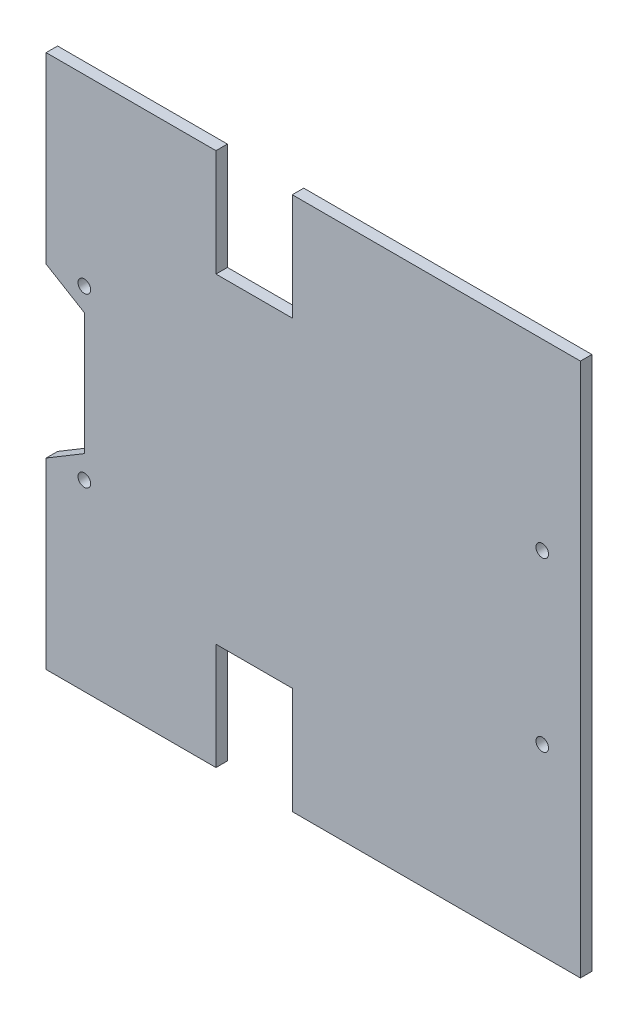
ISO-10303-21;
HEADER;
FILE_DESCRIPTION(('STEP AP214'),'2;1');
FILE_NAME('part.step','',(''),(''),'','','');
FILE_SCHEMA(('AUTOMOTIVE_DESIGN { 1 0 10303 214 1 1 1 1 }'));
ENDSEC;
DATA;
#1=APPLICATION_CONTEXT('core data for automotive mechanical design processes');
#2=APPLICATION_PROTOCOL_DEFINITION('international standard','automotive_design',2000,#1);
#3=PRODUCT_CONTEXT('',#1,'mechanical');
#4=PRODUCT('Part','Part','',(#3));
#5=PRODUCT_RELATED_PRODUCT_CATEGORY('part','',(#4));
#6=PRODUCT_DEFINITION_FORMATION('','',#4);
#7=PRODUCT_DEFINITION_CONTEXT('part definition',#1,'design');
#8=PRODUCT_DEFINITION('design','',#6,#7);
#9=PRODUCT_DEFINITION_SHAPE('','',#8);
#10=(LENGTH_UNIT() NAMED_UNIT(*) SI_UNIT(.MILLI.,.METRE.));
#11=(NAMED_UNIT(*) PLANE_ANGLE_UNIT() SI_UNIT($,.RADIAN.));
#12=(NAMED_UNIT(*) SI_UNIT($,.STERADIAN.) SOLID_ANGLE_UNIT());
#13=UNCERTAINTY_MEASURE_WITH_UNIT(LENGTH_MEASURE(1.E-05),#10,'distance_accuracy_value','');
#14=(GEOMETRIC_REPRESENTATION_CONTEXT(3) GLOBAL_UNCERTAINTY_ASSIGNED_CONTEXT((#13)) GLOBAL_UNIT_ASSIGNED_CONTEXT((#10,
#11,#12)) REPRESENTATION_CONTEXT('',''));
#15=CARTESIAN_POINT('',(0.,0.,0.));
#16=DIRECTION('',(0.,0.,1.));
#17=DIRECTION('',(1.,0.,0.));
#18=AXIS2_PLACEMENT_3D('',#15,#16,#17);
#19=CARTESIAN_POINT('',(0.,-26.,3.));
#20=DIRECTION('',(0.,0.,1.));
#21=DIRECTION('',(1.,0.,0.));
#22=AXIS2_PLACEMENT_3D('',#19,#20,#21);
#23=PLANE('',#22);
#24=CARTESIAN_POINT('',(10.,22.,3.));
#25=DIRECTION('',(0.,0.,1.));
#26=DIRECTION('',(1.,0.,0.));
#27=AXIS2_PLACEMENT_3D('',#24,#25,#26);
#28=CIRCLE('',#27,1.65);
#29=CARTESIAN_POINT('',(11.65,22.,3.));
#30=VERTEX_POINT('',#29);
#31=EDGE_CURVE('E346',#30,#30,#28,.T.);
#32=ORIENTED_EDGE('',*,*,#31,.F.);
#33=EDGE_LOOP('',(#32));
#34=FACE_BOUND('',#33,.T.);
#35=CARTESIAN_POINT('',(130.,66.,3.));
#36=DIRECTION('',(0.,0.,1.));
#37=DIRECTION('',(-1.,0.,0.));
#38=AXIS2_PLACEMENT_3D('',#35,#36,#37);
#39=CIRCLE('',#38,1.65000000000002);
#40=CARTESIAN_POINT('',(128.35,66.,3.));
#41=VERTEX_POINT('',#40);
#42=EDGE_CURVE('E183',#41,#41,#39,.T.);
#43=ORIENTED_EDGE('',*,*,#42,.F.);
#44=EDGE_LOOP('',(#43));
#45=FACE_BOUND('',#44,.T.);
#46=DIRECTION('',(0.,-1.,0.));
#47=VECTOR('',#46,1.);
#48=CARTESIAN_POINT('',(0.,21.9999999999925,3.));
#49=LINE('',#48,#47);
#50=CARTESIAN_POINT('',(0.,21.9999999999925,3.));
#51=VERTEX_POINT('',#50);
#52=CARTESIAN_POINT('',(0.,-26.,3.));
#53=VERTEX_POINT('',#52);
#54=EDGE_CURVE('E211',#51,#53,#49,.T.);
#55=ORIENTED_EDGE('',*,*,#54,.T.);
#56=DIRECTION('',(1.,0.,0.));
#57=VECTOR('',#56,1.);
#58=CARTESIAN_POINT('',(0.,-26.,3.));
#59=LINE('',#58,#57);
#60=CARTESIAN_POINT('',(44.5,-26.,3.));
#61=VERTEX_POINT('',#60);
#62=EDGE_CURVE('E118',#53,#61,#59,.T.);
#63=ORIENTED_EDGE('',*,*,#62,.T.);
#64=DIRECTION('',(0.,1.,0.));
#65=VECTOR('',#64,1.);
#66=CARTESIAN_POINT('',(44.5,-26.,3.));
#67=LINE('',#66,#65);
#68=CARTESIAN_POINT('',(44.5,1.99999999999998,3.));
#69=VERTEX_POINT('',#68);
#70=EDGE_CURVE('E250',#61,#69,#67,.T.);
#71=ORIENTED_EDGE('',*,*,#70,.T.);
#72=DIRECTION('',(1.,0.,0.));
#73=VECTOR('',#72,1.);
#74=CARTESIAN_POINT('',(44.5,1.99999999999998,3.));
#75=LINE('',#74,#73);
#76=CARTESIAN_POINT('',(64.5,1.99999999999999,3.));
#77=VERTEX_POINT('',#76);
#78=EDGE_CURVE('E269',#69,#77,#75,.T.);
#79=ORIENTED_EDGE('',*,*,#78,.T.);
#80=DIRECTION('',(0.,-1.,0.));
#81=VECTOR('',#80,1.);
#82=CARTESIAN_POINT('',(64.5,-26.,3.));
#83=LINE('',#82,#81);
#84=CARTESIAN_POINT('',(64.5,-26.,3.));
#85=VERTEX_POINT('',#84);
#86=EDGE_CURVE('E266',#77,#85,#83,.T.);
#87=ORIENTED_EDGE('',*,*,#86,.T.);
#88=DIRECTION('',(1.,0.,0.));
#89=VECTOR('',#88,1.);
#90=CARTESIAN_POINT('',(64.5,-26.,3.));
#91=LINE('',#90,#89);
#92=CARTESIAN_POINT('',(140.,-26.,3.));
#93=VERTEX_POINT('',#92);
#94=EDGE_CURVE('E268',#85,#93,#91,.T.);
#95=ORIENTED_EDGE('',*,*,#94,.T.);
#96=DIRECTION('',(0.,1.,0.));
#97=VECTOR('',#96,1.);
#98=CARTESIAN_POINT('',(140.,-26.,3.));
#99=LINE('',#98,#97);
#100=CARTESIAN_POINT('',(140.,114.,3.));
#101=VERTEX_POINT('',#100);
#102=EDGE_CURVE('E271',#93,#101,#99,.T.);
#103=ORIENTED_EDGE('',*,*,#102,.T.);
#104=DIRECTION('',(-1.,0.,0.));
#105=VECTOR('',#104,1.);
#106=CARTESIAN_POINT('',(64.5,114.,3.));
#107=LINE('',#106,#105);
#108=CARTESIAN_POINT('',(64.5,114.,3.));
#109=VERTEX_POINT('',#108);
#110=EDGE_CURVE('E277',#101,#109,#107,.T.);
#111=ORIENTED_EDGE('',*,*,#110,.T.);
#112=DIRECTION('',(0.,-1.,0.));
#113=VECTOR('',#112,1.);
#114=CARTESIAN_POINT('',(64.5,86.,3.));
#115=LINE('',#114,#113);
#116=CARTESIAN_POINT('',(64.5,86.,3.));
#117=VERTEX_POINT('',#116);
#118=EDGE_CURVE('E279',#109,#117,#115,.T.);
#119=ORIENTED_EDGE('',*,*,#118,.T.);
#120=DIRECTION('',(-1.,0.,0.));
#121=VECTOR('',#120,1.);
#122=CARTESIAN_POINT('',(64.5,86.,3.));
#123=LINE('',#122,#121);
#124=CARTESIAN_POINT('',(44.5,86.,3.));
#125=VERTEX_POINT('',#124);
#126=EDGE_CURVE('E281',#117,#125,#123,.T.);
#127=ORIENTED_EDGE('',*,*,#126,.T.);
#128=DIRECTION('',(0.,1.,0.));
#129=VECTOR('',#128,1.);
#130=CARTESIAN_POINT('',(44.5,86.,3.));
#131=LINE('',#130,#129);
#132=CARTESIAN_POINT('',(44.5,114.,3.));
#133=VERTEX_POINT('',#132);
#134=EDGE_CURVE('E283',#125,#133,#131,.T.);
#135=ORIENTED_EDGE('',*,*,#134,.T.);
#136=DIRECTION('',(-1.,0.,0.));
#137=VECTOR('',#136,1.);
#138=CARTESIAN_POINT('',(0.,114.,3.));
#139=LINE('',#138,#137);
#140=CARTESIAN_POINT('',(0.,114.,3.));
#141=VERTEX_POINT('',#140);
#142=EDGE_CURVE('E285',#133,#141,#139,.T.);
#143=ORIENTED_EDGE('',*,*,#142,.T.);
#144=DIRECTION('',(0.,-1.,0.));
#145=VECTOR('',#144,1.);
#146=CARTESIAN_POINT('',(0.,114.,3.));
#147=LINE('',#146,#145);
#148=CARTESIAN_POINT('',(0.,66.0000000000075,3.));
#149=VERTEX_POINT('',#148);
#150=EDGE_CURVE('E161',#141,#149,#147,.T.);
#151=ORIENTED_EDGE('',*,*,#150,.T.);
#152=DIRECTION('',(0.857492925712262,-0.514495755427997,0.));
#153=VECTOR('',#152,1.);
#154=CARTESIAN_POINT('',(9.99999999999995,60.,3.));
#155=LINE('',#154,#153);
#156=CARTESIAN_POINT('',(9.99999999999995,60.,3.));
#157=VERTEX_POINT('',#156);
#158=EDGE_CURVE('E155',#149,#157,#155,.T.);
#159=ORIENTED_EDGE('',*,*,#158,.T.);
#160=DIRECTION('',(0.,-1.,0.));
#161=VECTOR('',#160,1.);
#162=CARTESIAN_POINT('',(9.99999999999995,60.,3.));
#163=LINE('',#162,#161);
#164=CARTESIAN_POINT('',(9.99999999999995,28.,3.));
#165=VERTEX_POINT('',#164);
#166=EDGE_CURVE('E159',#157,#165,#163,.T.);
#167=ORIENTED_EDGE('',*,*,#166,.T.);
#168=DIRECTION('',(-0.857492925712261,-0.514495755427998,0.));
#169=VECTOR('',#168,1.);
#170=CARTESIAN_POINT('',(9.99999999999995,28.,3.));
#171=LINE('',#170,#169);
#172=EDGE_CURVE('E51',#165,#51,#171,.T.);
#173=ORIENTED_EDGE('',*,*,#172,.T.);
#174=EDGE_LOOP('',(#55,#63,#71,#79,#87,#95,#103,#111,#119,#127,#135,#143,#151,#159,#167,#173));
#175=FACE_BOUND('',#174,.T.);
#176=CARTESIAN_POINT('',(10.,66.,3.));
#177=DIRECTION('',(0.,0.,1.));
#178=DIRECTION('',(-1.,0.,0.));
#179=AXIS2_PLACEMENT_3D('',#176,#177,#178);
#180=CIRCLE('',#179,1.65);
#181=CARTESIAN_POINT('',(8.35000000000001,66.,3.));
#182=VERTEX_POINT('',#181);
#183=EDGE_CURVE('E352',#182,#182,#180,.T.);
#184=ORIENTED_EDGE('',*,*,#183,.F.);
#185=EDGE_LOOP('',(#184));
#186=FACE_BOUND('',#185,.T.);
#187=CARTESIAN_POINT('',(130.,22.,3.));
#188=DIRECTION('',(0.,0.,1.));
#189=DIRECTION('',(1.,0.,0.));
#190=AXIS2_PLACEMENT_3D('',#187,#188,#189);
#191=CIRCLE('',#190,1.65000000000002);
#192=CARTESIAN_POINT('',(131.65,22.,3.));
#193=VERTEX_POINT('',#192);
#194=EDGE_CURVE('E337',#193,#193,#191,.T.);
#195=ORIENTED_EDGE('',*,*,#194,.F.);
#196=EDGE_LOOP('',(#195));
#197=FACE_BOUND('',#196,.T.);
#198=ADVANCED_FACE('F34',(#34,#45,#175,#186,#197),#23,.T.);
#199=CARTESIAN_POINT('',(0.,-26.,0.));
#200=DIRECTION('',(0.,0.,1.));
#201=DIRECTION('',(1.,0.,0.));
#202=AXIS2_PLACEMENT_3D('',#199,#200,#201);
#203=PLANE('',#202);
#204=CARTESIAN_POINT('',(10.,22.,0.));
#205=DIRECTION('',(0.,0.,1.));
#206=DIRECTION('',(1.,0.,0.));
#207=AXIS2_PLACEMENT_3D('',#204,#205,#206);
#208=CIRCLE('',#207,1.65);
#209=CARTESIAN_POINT('',(11.65,22.,0.));
#210=VERTEX_POINT('',#209);
#211=EDGE_CURVE('E343',#210,#210,#208,.T.);
#212=ORIENTED_EDGE('',*,*,#211,.T.);
#213=EDGE_LOOP('',(#212));
#214=FACE_BOUND('',#213,.T.);
#215=CARTESIAN_POINT('',(130.,66.,0.));
#216=DIRECTION('',(0.,0.,1.));
#217=DIRECTION('',(-1.,0.,0.));
#218=AXIS2_PLACEMENT_3D('',#215,#216,#217);
#219=CIRCLE('',#218,1.65000000000002);
#220=CARTESIAN_POINT('',(128.35,66.,0.));
#221=VERTEX_POINT('',#220);
#222=EDGE_CURVE('E355',#221,#221,#219,.T.);
#223=ORIENTED_EDGE('',*,*,#222,.T.);
#224=EDGE_LOOP('',(#223));
#225=FACE_BOUND('',#224,.T.);
#226=DIRECTION('',(0.,-1.,0.));
#227=VECTOR('',#226,1.);
#228=CARTESIAN_POINT('',(0.,21.9999999999925,0.));
#229=LINE('',#228,#227);
#230=CARTESIAN_POINT('',(0.,21.9999999999925,0.));
#231=VERTEX_POINT('',#230);
#232=CARTESIAN_POINT('',(0.,-26.,0.));
#233=VERTEX_POINT('',#232);
#234=EDGE_CURVE('E179',#231,#233,#229,.T.);
#235=ORIENTED_EDGE('',*,*,#234,.F.);
#236=DIRECTION('',(-0.857492925712261,-0.514495755427998,0.));
#237=VECTOR('',#236,1.);
#238=CARTESIAN_POINT('',(9.99999999999995,28.,0.));
#239=LINE('',#238,#237);
#240=CARTESIAN_POINT('',(9.99999999999995,28.,0.));
#241=VERTEX_POINT('',#240);
#242=EDGE_CURVE('E110',#241,#231,#239,.T.);
#243=ORIENTED_EDGE('',*,*,#242,.F.);
#244=DIRECTION('',(0.,-1.,0.));
#245=VECTOR('',#244,1.);
#246=CARTESIAN_POINT('',(9.99999999999995,60.,0.));
#247=LINE('',#246,#245);
#248=CARTESIAN_POINT('',(9.99999999999995,60.,0.));
#249=VERTEX_POINT('',#248);
#250=EDGE_CURVE('E104',#249,#241,#247,.T.);
#251=ORIENTED_EDGE('',*,*,#250,.F.);
#252=DIRECTION('',(0.857492925712262,-0.514495755427997,0.));
#253=VECTOR('',#252,1.);
#254=CARTESIAN_POINT('',(9.99999999999995,60.,0.));
#255=LINE('',#254,#253);
#256=CARTESIAN_POINT('',(0.,66.0000000000075,0.));
#257=VERTEX_POINT('',#256);
#258=EDGE_CURVE('E169',#257,#249,#255,.T.);
#259=ORIENTED_EDGE('',*,*,#258,.F.);
#260=DIRECTION('',(0.,-1.,0.));
#261=VECTOR('',#260,1.);
#262=CARTESIAN_POINT('',(0.,114.,0.));
#263=LINE('',#262,#261);
#264=CARTESIAN_POINT('',(0.,114.,0.));
#265=VERTEX_POINT('',#264);
#266=EDGE_CURVE('E206',#265,#257,#263,.T.);
#267=ORIENTED_EDGE('',*,*,#266,.F.);
#268=DIRECTION('',(-1.,0.,0.));
#269=VECTOR('',#268,1.);
#270=CARTESIAN_POINT('',(0.,114.,0.));
#271=LINE('',#270,#269);
#272=CARTESIAN_POINT('',(44.5,114.,0.));
#273=VERTEX_POINT('',#272);
#274=EDGE_CURVE('E204',#273,#265,#271,.T.);
#275=ORIENTED_EDGE('',*,*,#274,.F.);
#276=DIRECTION('',(0.,1.,0.));
#277=VECTOR('',#276,1.);
#278=CARTESIAN_POINT('',(44.5,86.,0.));
#279=LINE('',#278,#277);
#280=CARTESIAN_POINT('',(44.5,86.,0.));
#281=VERTEX_POINT('',#280);
#282=EDGE_CURVE('E202',#281,#273,#279,.T.);
#283=ORIENTED_EDGE('',*,*,#282,.F.);
#284=DIRECTION('',(-1.,0.,0.));
#285=VECTOR('',#284,1.);
#286=CARTESIAN_POINT('',(64.5,86.,0.));
#287=LINE('',#286,#285);
#288=CARTESIAN_POINT('',(64.5,86.,0.));
#289=VERTEX_POINT('',#288);
#290=EDGE_CURVE('E200',#289,#281,#287,.T.);
#291=ORIENTED_EDGE('',*,*,#290,.F.);
#292=DIRECTION('',(0.,-1.,0.));
#293=VECTOR('',#292,1.);
#294=CARTESIAN_POINT('',(64.5,86.,0.));
#295=LINE('',#294,#293);
#296=CARTESIAN_POINT('',(64.5,114.,0.));
#297=VERTEX_POINT('',#296);
#298=EDGE_CURVE('E198',#297,#289,#295,.T.);
#299=ORIENTED_EDGE('',*,*,#298,.F.);
#300=DIRECTION('',(-1.,0.,0.));
#301=VECTOR('',#300,1.);
#302=CARTESIAN_POINT('',(64.5,114.,0.));
#303=LINE('',#302,#301);
#304=CARTESIAN_POINT('',(140.,114.,0.));
#305=VERTEX_POINT('',#304);
#306=EDGE_CURVE('E196',#305,#297,#303,.T.);
#307=ORIENTED_EDGE('',*,*,#306,.F.);
#308=DIRECTION('',(0.,1.,0.));
#309=VECTOR('',#308,1.);
#310=CARTESIAN_POINT('',(140.,114.,0.));
#311=LINE('',#310,#309);
#312=CARTESIAN_POINT('',(140.,-26.,0.));
#313=VERTEX_POINT('',#312);
#314=EDGE_CURVE('E194',#313,#305,#311,.T.);
#315=ORIENTED_EDGE('',*,*,#314,.F.);
#316=DIRECTION('',(1.,0.,0.));
#317=VECTOR('',#316,1.);
#318=CARTESIAN_POINT('',(64.5,-26.,0.));
#319=LINE('',#318,#317);
#320=CARTESIAN_POINT('',(64.5,-26.,0.));
#321=VERTEX_POINT('',#320);
#322=EDGE_CURVE('E191',#321,#313,#319,.T.);
#323=ORIENTED_EDGE('',*,*,#322,.F.);
#324=DIRECTION('',(0.,-1.,0.));
#325=VECTOR('',#324,1.);
#326=CARTESIAN_POINT('',(64.5,-26.,0.));
#327=LINE('',#326,#325);
#328=CARTESIAN_POINT('',(64.5,1.99999999999999,0.));
#329=VERTEX_POINT('',#328);
#330=EDGE_CURVE('E189',#329,#321,#327,.T.);
#331=ORIENTED_EDGE('',*,*,#330,.F.);
#332=DIRECTION('',(1.,0.,0.));
#333=VECTOR('',#332,1.);
#334=CARTESIAN_POINT('',(44.5,1.99999999999998,0.));
#335=LINE('',#334,#333);
#336=CARTESIAN_POINT('',(44.5,1.99999999999998,0.));
#337=VERTEX_POINT('',#336);
#338=EDGE_CURVE('E187',#337,#329,#335,.T.);
#339=ORIENTED_EDGE('',*,*,#338,.F.);
#340=DIRECTION('',(0.,1.,0.));
#341=VECTOR('',#340,1.);
#342=CARTESIAN_POINT('',(44.5,-26.,0.));
#343=LINE('',#342,#341);
#344=CARTESIAN_POINT('',(44.5,-26.,0.));
#345=VERTEX_POINT('',#344);
#346=EDGE_CURVE('E185',#345,#337,#343,.T.);
#347=ORIENTED_EDGE('',*,*,#346,.F.);
#348=DIRECTION('',(1.,0.,0.));
#349=VECTOR('',#348,1.);
#350=CARTESIAN_POINT('',(0.,-26.,0.));
#351=LINE('',#350,#349);
#352=EDGE_CURVE('E182',#233,#345,#351,.T.);
#353=ORIENTED_EDGE('',*,*,#352,.F.);
#354=EDGE_LOOP('',(#235,#243,#251,#259,#267,#275,#283,#291,#299,#307,#315,#323,#331,#339,#347,#353));
#355=FACE_BOUND('',#354,.T.);
#356=CARTESIAN_POINT('',(10.,66.,0.));
#357=DIRECTION('',(0.,0.,1.));
#358=DIRECTION('',(-1.,0.,0.));
#359=AXIS2_PLACEMENT_3D('',#356,#357,#358);
#360=CIRCLE('',#359,1.65);
#361=CARTESIAN_POINT('',(8.35000000000001,66.,0.));
#362=VERTEX_POINT('',#361);
#363=EDGE_CURVE('E349',#362,#362,#360,.T.);
#364=ORIENTED_EDGE('',*,*,#363,.T.);
#365=EDGE_LOOP('',(#364));
#366=FACE_BOUND('',#365,.T.);
#367=CARTESIAN_POINT('',(130.,22.,0.));
#368=DIRECTION('',(0.,0.,1.));
#369=DIRECTION('',(1.,0.,0.));
#370=AXIS2_PLACEMENT_3D('',#367,#368,#369);
#371=CIRCLE('',#370,1.65000000000002);
#372=CARTESIAN_POINT('',(131.65,22.,0.));
#373=VERTEX_POINT('',#372);
#374=EDGE_CURVE('E340',#373,#373,#371,.T.);
#375=ORIENTED_EDGE('',*,*,#374,.T.);
#376=EDGE_LOOP('',(#375));
#377=FACE_BOUND('',#376,.T.);
#378=ADVANCED_FACE('F254',(#214,#225,#355,#366,#377),#203,.F.);
#379=CARTESIAN_POINT('',(0.,21.9999999999925,3.));
#380=DIRECTION('',(1.,0.,0.));
#381=DIRECTION('',(0.,1.,0.));
#382=AXIS2_PLACEMENT_3D('',#379,#380,#381);
#383=PLANE('',#382);
#384=ORIENTED_EDGE('',*,*,#234,.T.);
#385=DIRECTION('',(0.,0.,-1.));
#386=VECTOR('',#385,1.);
#387=CARTESIAN_POINT('',(0.,-26.,3.));
#388=LINE('',#387,#386);
#389=EDGE_CURVE('E11',#53,#233,#388,.T.);
#390=ORIENTED_EDGE('',*,*,#389,.F.);
#391=ORIENTED_EDGE('',*,*,#54,.F.);
#392=DIRECTION('',(0.,0.,-1.));
#393=VECTOR('',#392,1.);
#394=CARTESIAN_POINT('',(0.,21.9999999999925,3.));
#395=LINE('',#394,#393);
#396=EDGE_CURVE('E175',#51,#231,#395,.T.);
#397=ORIENTED_EDGE('',*,*,#396,.T.);
#398=EDGE_LOOP('',(#384,#390,#391,#397));
#399=FACE_BOUND('',#398,.T.);
#400=ADVANCED_FACE('F36',(#399),#383,.F.);
#401=CARTESIAN_POINT('',(0.,-26.,3.));
#402=DIRECTION('',(0.,1.,0.));
#403=DIRECTION('',(0.,0.,1.));
#404=AXIS2_PLACEMENT_3D('',#401,#402,#403);
#405=PLANE('',#404);
#406=ORIENTED_EDGE('',*,*,#352,.T.);
#407=DIRECTION('',(0.,0.,-1.));
#408=VECTOR('',#407,1.);
#409=CARTESIAN_POINT('',(44.5,-26.,3.));
#410=LINE('',#409,#408);
#411=EDGE_CURVE('E43',#61,#345,#410,.T.);
#412=ORIENTED_EDGE('',*,*,#411,.F.);
#413=ORIENTED_EDGE('',*,*,#62,.F.);
#414=ORIENTED_EDGE('',*,*,#389,.T.);
#415=EDGE_LOOP('',(#406,#412,#413,#414));
#416=FACE_BOUND('',#415,.T.);
#417=ADVANCED_FACE('F506',(#416),#405,.F.);
#418=CARTESIAN_POINT('',(44.5,-26.,3.));
#419=DIRECTION('',(-1.,0.,0.));
#420=DIRECTION('',(0.,0.,1.));
#421=AXIS2_PLACEMENT_3D('',#418,#419,#420);
#422=PLANE('',#421);
#423=ORIENTED_EDGE('',*,*,#346,.T.);
#424=DIRECTION('',(0.,0.,-1.));
#425=VECTOR('',#424,1.);
#426=CARTESIAN_POINT('',(44.5,1.99999999999998,3.));
#427=LINE('',#426,#425);
#428=EDGE_CURVE('E242',#69,#337,#427,.T.);
#429=ORIENTED_EDGE('',*,*,#428,.F.);
#430=ORIENTED_EDGE('',*,*,#70,.F.);
#431=ORIENTED_EDGE('',*,*,#411,.T.);
#432=EDGE_LOOP('',(#423,#429,#430,#431));
#433=FACE_BOUND('',#432,.T.);
#434=ADVANCED_FACE('F248',(#433),#422,.F.);
#435=CARTESIAN_POINT('',(44.5,1.99999999999998,3.));
#436=DIRECTION('',(0.,1.,0.));
#437=DIRECTION('',(-1.,0.,0.));
#438=AXIS2_PLACEMENT_3D('',#435,#436,#437);
#439=PLANE('',#438);
#440=ORIENTED_EDGE('',*,*,#338,.T.);
#441=DIRECTION('',(0.,0.,-1.));
#442=VECTOR('',#441,1.);
#443=CARTESIAN_POINT('',(64.5,1.99999999999999,3.));
#444=LINE('',#443,#442);
#445=EDGE_CURVE('E239',#77,#329,#444,.T.);
#446=ORIENTED_EDGE('',*,*,#445,.F.);
#447=ORIENTED_EDGE('',*,*,#78,.F.);
#448=ORIENTED_EDGE('',*,*,#428,.T.);
#449=EDGE_LOOP('',(#440,#446,#447,#448));
#450=FACE_BOUND('',#449,.T.);
#451=ADVANCED_FACE('F260',(#450),#439,.F.);
#452=CARTESIAN_POINT('',(64.5,-26.,3.));
#453=DIRECTION('',(1.,0.,0.));
#454=DIRECTION('',(0.,0.,-1.));
#455=AXIS2_PLACEMENT_3D('',#452,#453,#454);
#456=PLANE('',#455);
#457=ORIENTED_EDGE('',*,*,#330,.T.);
#458=DIRECTION('',(0.,0.,-1.));
#459=VECTOR('',#458,1.);
#460=CARTESIAN_POINT('',(64.5,-26.,3.));
#461=LINE('',#460,#459);
#462=EDGE_CURVE('E236',#85,#321,#461,.T.);
#463=ORIENTED_EDGE('',*,*,#462,.F.);
#464=ORIENTED_EDGE('',*,*,#86,.F.);
#465=ORIENTED_EDGE('',*,*,#445,.T.);
#466=EDGE_LOOP('',(#457,#463,#464,#465));
#467=FACE_BOUND('',#466,.T.);
#468=ADVANCED_FACE('F264',(#467),#456,.F.);
#469=CARTESIAN_POINT('',(64.5,-26.,3.));
#470=DIRECTION('',(0.,1.,0.));
#471=DIRECTION('',(0.,0.,1.));
#472=AXIS2_PLACEMENT_3D('',#469,#470,#471);
#473=PLANE('',#472);
#474=ORIENTED_EDGE('',*,*,#322,.T.);
#475=DIRECTION('',(0.,0.,-1.));
#476=VECTOR('',#475,1.);
#477=CARTESIAN_POINT('',(140.,-26.,3.));
#478=LINE('',#477,#476);
#479=EDGE_CURVE('E233',#93,#313,#478,.T.);
#480=ORIENTED_EDGE('',*,*,#479,.F.);
#481=ORIENTED_EDGE('',*,*,#94,.F.);
#482=ORIENTED_EDGE('',*,*,#462,.T.);
#483=EDGE_LOOP('',(#474,#480,#481,#482));
#484=FACE_BOUND('',#483,.T.);
#485=ADVANCED_FACE('F469',(#484),#473,.F.);
#486=CARTESIAN_POINT('',(140.,114.,3.));
#487=DIRECTION('',(-1.,0.,0.));
#488=DIRECTION('',(0.,0.,1.));
#489=AXIS2_PLACEMENT_3D('',#486,#487,#488);
#490=PLANE('',#489);
#491=ORIENTED_EDGE('',*,*,#314,.T.);
#492=DIRECTION('',(0.,0.,-1.));
#493=VECTOR('',#492,1.);
#494=CARTESIAN_POINT('',(140.,114.,3.));
#495=LINE('',#494,#493);
#496=EDGE_CURVE('E230',#101,#305,#495,.T.);
#497=ORIENTED_EDGE('',*,*,#496,.F.);
#498=ORIENTED_EDGE('',*,*,#102,.F.);
#499=ORIENTED_EDGE('',*,*,#479,.T.);
#500=EDGE_LOOP('',(#491,#497,#498,#499));
#501=FACE_BOUND('',#500,.T.);
#502=ADVANCED_FACE('F459',(#501),#490,.F.);
#503=CARTESIAN_POINT('',(64.5,114.,3.));
#504=DIRECTION('',(0.,-1.,0.));
#505=DIRECTION('',(1.,0.,0.));
#506=AXIS2_PLACEMENT_3D('',#503,#504,#505);
#507=PLANE('',#506);
#508=ORIENTED_EDGE('',*,*,#306,.T.);
#509=DIRECTION('',(0.,0.,-1.));
#510=VECTOR('',#509,1.);
#511=CARTESIAN_POINT('',(64.5,114.,3.));
#512=LINE('',#511,#510);
#513=EDGE_CURVE('E227',#109,#297,#512,.T.);
#514=ORIENTED_EDGE('',*,*,#513,.F.);
#515=ORIENTED_EDGE('',*,*,#110,.F.);
#516=ORIENTED_EDGE('',*,*,#496,.T.);
#517=EDGE_LOOP('',(#508,#514,#515,#516));
#518=FACE_BOUND('',#517,.T.);
#519=ADVANCED_FACE('F449',(#518),#507,.F.);
#520=CARTESIAN_POINT('',(64.5,86.,3.));
#521=DIRECTION('',(1.,0.,0.));
#522=DIRECTION('',(0.,1.,0.));
#523=AXIS2_PLACEMENT_3D('',#520,#521,#522);
#524=PLANE('',#523);
#525=ORIENTED_EDGE('',*,*,#298,.T.);
#526=DIRECTION('',(0.,0.,-1.));
#527=VECTOR('',#526,1.);
#528=CARTESIAN_POINT('',(64.5,86.,3.));
#529=LINE('',#528,#527);
#530=EDGE_CURVE('E224',#117,#289,#529,.T.);
#531=ORIENTED_EDGE('',*,*,#530,.F.);
#532=ORIENTED_EDGE('',*,*,#118,.F.);
#533=ORIENTED_EDGE('',*,*,#513,.T.);
#534=EDGE_LOOP('',(#525,#531,#532,#533));
#535=FACE_BOUND('',#534,.T.);
#536=ADVANCED_FACE('F439',(#535),#524,.F.);
#537=CARTESIAN_POINT('',(64.5,86.,3.));
#538=DIRECTION('',(0.,-1.,0.));
#539=DIRECTION('',(0.,0.,-1.));
#540=AXIS2_PLACEMENT_3D('',#537,#538,#539);
#541=PLANE('',#540);
#542=ORIENTED_EDGE('',*,*,#290,.T.);
#543=DIRECTION('',(0.,0.,-1.));
#544=VECTOR('',#543,1.);
#545=CARTESIAN_POINT('',(44.5,86.,3.));
#546=LINE('',#545,#544);
#547=EDGE_CURVE('E221',#125,#281,#546,.T.);
#548=ORIENTED_EDGE('',*,*,#547,.F.);
#549=ORIENTED_EDGE('',*,*,#126,.F.);
#550=ORIENTED_EDGE('',*,*,#530,.T.);
#551=EDGE_LOOP('',(#542,#548,#549,#550));
#552=FACE_BOUND('',#551,.T.);
#553=ADVANCED_FACE('F429',(#552),#541,.F.);
#554=CARTESIAN_POINT('',(44.5,86.,3.));
#555=DIRECTION('',(-1.,0.,0.));
#556=DIRECTION('',(0.,0.,1.));
#557=AXIS2_PLACEMENT_3D('',#554,#555,#556);
#558=PLANE('',#557);
#559=ORIENTED_EDGE('',*,*,#282,.T.);
#560=DIRECTION('',(0.,0.,-1.));
#561=VECTOR('',#560,1.);
#562=CARTESIAN_POINT('',(44.5,114.,3.));
#563=LINE('',#562,#561);
#564=EDGE_CURVE('E218',#133,#273,#563,.T.);
#565=ORIENTED_EDGE('',*,*,#564,.F.);
#566=ORIENTED_EDGE('',*,*,#134,.F.);
#567=ORIENTED_EDGE('',*,*,#547,.T.);
#568=EDGE_LOOP('',(#559,#565,#566,#567));
#569=FACE_BOUND('',#568,.T.);
#570=ADVANCED_FACE('F420',(#569),#558,.F.);
#571=CARTESIAN_POINT('',(0.,114.,3.));
#572=DIRECTION('',(0.,-1.,0.));
#573=DIRECTION('',(1.,0.,0.));
#574=AXIS2_PLACEMENT_3D('',#571,#572,#573);
#575=PLANE('',#574);
#576=ORIENTED_EDGE('',*,*,#274,.T.);
#577=DIRECTION('',(0.,0.,-1.));
#578=VECTOR('',#577,1.);
#579=CARTESIAN_POINT('',(0.,114.,3.));
#580=LINE('',#579,#578);
#581=EDGE_CURVE('E215',#141,#265,#580,.T.);
#582=ORIENTED_EDGE('',*,*,#581,.F.);
#583=ORIENTED_EDGE('',*,*,#142,.F.);
#584=ORIENTED_EDGE('',*,*,#564,.T.);
#585=EDGE_LOOP('',(#576,#582,#583,#584));
#586=FACE_BOUND('',#585,.T.);
#587=ADVANCED_FACE('F291',(#586),#575,.F.);
#588=CARTESIAN_POINT('',(0.,114.,3.));
#589=DIRECTION('',(1.,0.,0.));
#590=DIRECTION('',(0.,1.,0.));
#591=AXIS2_PLACEMENT_3D('',#588,#589,#590);
#592=PLANE('',#591);
#593=ORIENTED_EDGE('',*,*,#266,.T.);
#594=DIRECTION('',(0.,0.,-1.));
#595=VECTOR('',#594,1.);
#596=CARTESIAN_POINT('',(0.,66.0000000000075,3.));
#597=LINE('',#596,#595);
#598=EDGE_CURVE('E170',#149,#257,#597,.T.);
#599=ORIENTED_EDGE('',*,*,#598,.F.);
#600=ORIENTED_EDGE('',*,*,#150,.F.);
#601=ORIENTED_EDGE('',*,*,#581,.T.);
#602=EDGE_LOOP('',(#593,#599,#600,#601));
#603=FACE_BOUND('',#602,.T.);
#604=ADVANCED_FACE('F295',(#603),#592,.F.);
#605=CARTESIAN_POINT('',(9.99999999999995,60.,3.));
#606=DIRECTION('',(0.514495755427998,0.857492925712262,0.));
#607=DIRECTION('',(-0.857492925712262,0.514495755427998,0.));
#608=AXIS2_PLACEMENT_3D('',#605,#606,#607);
#609=PLANE('',#608);
#610=ORIENTED_EDGE('',*,*,#258,.T.);
#611=DIRECTION('',(0.,0.,-1.));
#612=VECTOR('',#611,1.);
#613=CARTESIAN_POINT('',(9.99999999999995,60.,3.));
#614=LINE('',#613,#612);
#615=EDGE_CURVE('E166',#157,#249,#614,.T.);
#616=ORIENTED_EDGE('',*,*,#615,.F.);
#617=ORIENTED_EDGE('',*,*,#158,.F.);
#618=ORIENTED_EDGE('',*,*,#598,.T.);
#619=EDGE_LOOP('',(#610,#616,#617,#618));
#620=FACE_BOUND('',#619,.T.);
#621=ADVANCED_FACE('F167',(#620),#609,.F.);
#622=CARTESIAN_POINT('',(9.99999999999995,60.,3.));
#623=DIRECTION('',(1.,0.,0.));
#624=DIRECTION('',(0.,0.,-1.));
#625=AXIS2_PLACEMENT_3D('',#622,#623,#624);
#626=PLANE('',#625);
#627=ORIENTED_EDGE('',*,*,#250,.T.);
#628=DIRECTION('',(0.,0.,-1.));
#629=VECTOR('',#628,1.);
#630=CARTESIAN_POINT('',(9.99999999999995,28.,3.));
#631=LINE('',#630,#629);
#632=EDGE_CURVE('E171',#165,#241,#631,.T.);
#633=ORIENTED_EDGE('',*,*,#632,.F.);
#634=ORIENTED_EDGE('',*,*,#166,.F.);
#635=ORIENTED_EDGE('',*,*,#615,.T.);
#636=EDGE_LOOP('',(#627,#633,#634,#635));
#637=FACE_BOUND('',#636,.T.);
#638=ADVANCED_FACE('F173',(#637),#626,.F.);
#639=CARTESIAN_POINT('',(9.99999999999995,28.,3.));
#640=DIRECTION('',(0.514495755427998,-0.857492925712261,0.));
#641=DIRECTION('',(0.857492925712261,0.514495755427998,0.));
#642=AXIS2_PLACEMENT_3D('',#639,#640,#641);
#643=PLANE('',#642);
#644=ORIENTED_EDGE('',*,*,#242,.T.);
#645=ORIENTED_EDGE('',*,*,#396,.F.);
#646=ORIENTED_EDGE('',*,*,#172,.F.);
#647=ORIENTED_EDGE('',*,*,#632,.T.);
#648=EDGE_LOOP('',(#644,#645,#646,#647));
#649=FACE_BOUND('',#648,.T.);
#650=ADVANCED_FACE('F299',(#649),#643,.F.);
#651=CARTESIAN_POINT('',(130.,66.,3.));
#652=DIRECTION('',(0.,0.,-1.));
#653=DIRECTION('',(-1.,0.,0.));
#654=AXIS2_PLACEMENT_3D('',#651,#652,#653);
#655=CYLINDRICAL_SURFACE('',#654,1.65000000000002);
#656=ORIENTED_EDGE('',*,*,#42,.T.);
#657=EDGE_LOOP('',(#656));
#658=FACE_BOUND('',#657,.T.);
#659=ORIENTED_EDGE('',*,*,#222,.F.);
#660=EDGE_LOOP('',(#659));
#661=FACE_BOUND('',#660,.T.);
#662=ADVANCED_FACE('F301',(#658,#661),#655,.F.);
#663=CARTESIAN_POINT('',(10.,66.,3.));
#664=DIRECTION('',(0.,0.,-1.));
#665=DIRECTION('',(-1.,0.,0.));
#666=AXIS2_PLACEMENT_3D('',#663,#664,#665);
#667=CYLINDRICAL_SURFACE('',#666,1.65);
#668=ORIENTED_EDGE('',*,*,#183,.T.);
#669=EDGE_LOOP('',(#668));
#670=FACE_BOUND('',#669,.T.);
#671=ORIENTED_EDGE('',*,*,#363,.F.);
#672=EDGE_LOOP('',(#671));
#673=FACE_BOUND('',#672,.T.);
#674=ADVANCED_FACE('F307',(#670,#673),#667,.F.);
#675=CARTESIAN_POINT('',(10.,22.,3.));
#676=DIRECTION('',(0.,0.,-1.));
#677=DIRECTION('',(-1.,0.,0.));
#678=AXIS2_PLACEMENT_3D('',#675,#676,#677);
#679=CYLINDRICAL_SURFACE('',#678,1.65);
#680=ORIENTED_EDGE('',*,*,#31,.T.);
#681=EDGE_LOOP('',(#680));
#682=FACE_BOUND('',#681,.T.);
#683=ORIENTED_EDGE('',*,*,#211,.F.);
#684=EDGE_LOOP('',(#683));
#685=FACE_BOUND('',#684,.T.);
#686=ADVANCED_FACE('F324',(#682,#685),#679,.F.);
#687=CARTESIAN_POINT('',(130.,22.,3.));
#688=DIRECTION('',(0.,0.,-1.));
#689=DIRECTION('',(-1.,0.,0.));
#690=AXIS2_PLACEMENT_3D('',#687,#688,#689);
#691=CYLINDRICAL_SURFACE('',#690,1.65000000000002);
#692=ORIENTED_EDGE('',*,*,#194,.T.);
#693=EDGE_LOOP('',(#692));
#694=FACE_BOUND('',#693,.T.);
#695=ORIENTED_EDGE('',*,*,#374,.F.);
#696=EDGE_LOOP('',(#695));
#697=FACE_BOUND('',#696,.T.);
#698=ADVANCED_FACE('F328',(#694,#697),#691,.F.);
#699=CLOSED_SHELL('',(#198,#378,#400,#417,#434,#451,#468,#485,#502,#519,#536,#553,#570,#587,
#604,#621,#638,#650,#662,#674,#686,#698));
#700=MANIFOLD_SOLID_BREP('B2',#699);
#701=ADVANCED_BREP_SHAPE_REPRESENTATION('',(#18,#700),#14);
#702=SHAPE_DEFINITION_REPRESENTATION(#9,#701);
ENDSEC;
END-ISO-10303-21;
